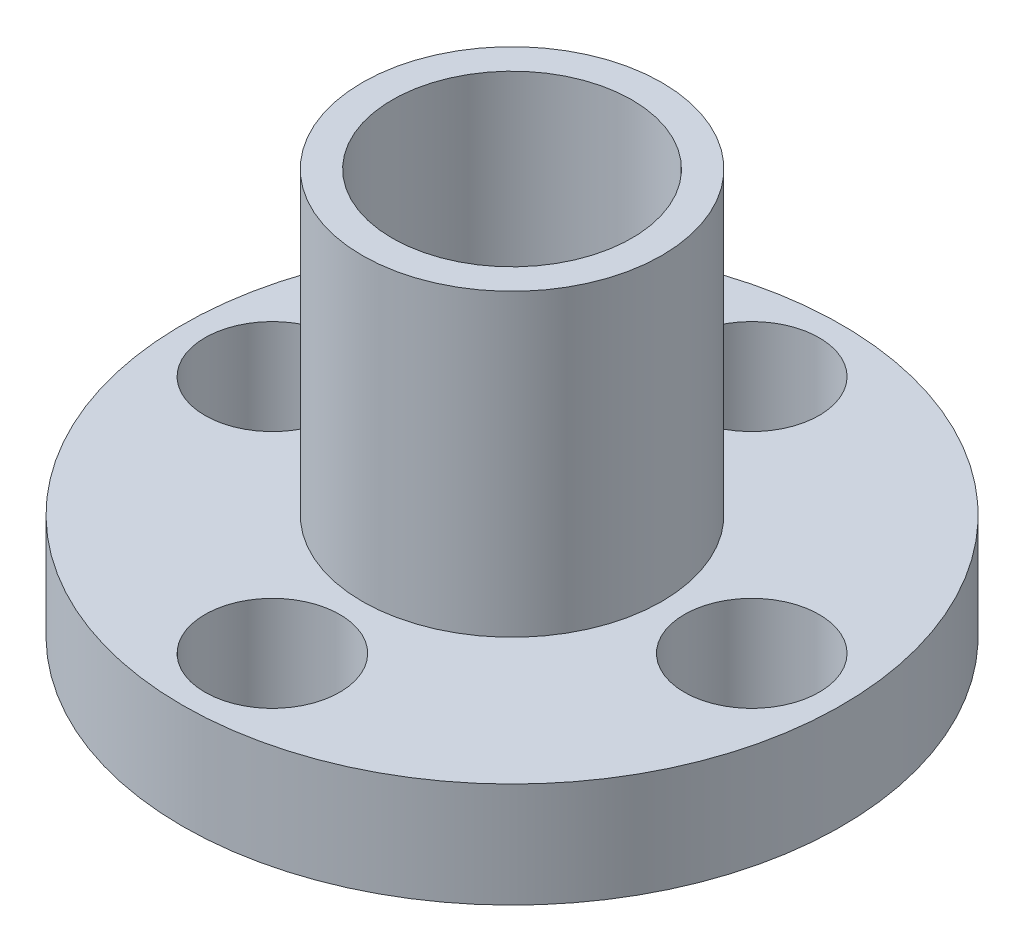
ISO-10303-21;
HEADER;
FILE_DESCRIPTION(('STEP AP214'),'2;1');
FILE_NAME('part.step','',(''),(''),'','','');
FILE_SCHEMA(('AUTOMOTIVE_DESIGN { 1 0 10303 214 1 1 1 1 }'));
ENDSEC;
DATA;
#1=APPLICATION_CONTEXT('core data for automotive mechanical design processes');
#2=APPLICATION_PROTOCOL_DEFINITION('international standard','automotive_design',2000,#1);
#3=PRODUCT_CONTEXT('',#1,'mechanical');
#4=PRODUCT('Part','Part','',(#3));
#5=PRODUCT_RELATED_PRODUCT_CATEGORY('part','',(#4));
#6=PRODUCT_DEFINITION_FORMATION('','',#4);
#7=PRODUCT_DEFINITION_CONTEXT('part definition',#1,'design');
#8=PRODUCT_DEFINITION('design','',#6,#7);
#9=PRODUCT_DEFINITION_SHAPE('','',#8);
#10=(LENGTH_UNIT() NAMED_UNIT(*) SI_UNIT(.MILLI.,.METRE.));
#11=(NAMED_UNIT(*) PLANE_ANGLE_UNIT() SI_UNIT($,.RADIAN.));
#12=(NAMED_UNIT(*) SI_UNIT($,.STERADIAN.) SOLID_ANGLE_UNIT());
#13=UNCERTAINTY_MEASURE_WITH_UNIT(LENGTH_MEASURE(1.E-05),#10,'distance_accuracy_value','');
#14=(GEOMETRIC_REPRESENTATION_CONTEXT(3) GLOBAL_UNCERTAINTY_ASSIGNED_CONTEXT((#13)) GLOBAL_UNIT_ASSIGNED_CONTEXT((#10,
#11,#12)) REPRESENTATION_CONTEXT('',''));
#15=CARTESIAN_POINT('',(0.,0.,0.));
#16=DIRECTION('',(0.,0.,1.));
#17=DIRECTION('',(1.,0.,0.));
#18=AXIS2_PLACEMENT_3D('',#15,#16,#17);
#19=CARTESIAN_POINT('',(0.,0.,0.));
#20=DIRECTION('',(0.,1.,0.));
#21=DIRECTION('',(0.,0.,1.));
#22=AXIS2_PLACEMENT_3D('',#19,#20,#21);
#23=PLANE('',#22);
#24=CARTESIAN_POINT('',(-7.99999999999977,0.,2.27373723977622E-13));
#25=DIRECTION('',(0.,1.,0.));
#26=DIRECTION('',(0.,0.,1.));
#27=AXIS2_PLACEMENT_3D('',#24,#25,#26);
#28=CIRCLE('',#27,2.25000000000036);
#29=CARTESIAN_POINT('',(-7.99999999999977,0.,2.25000000000059));
#30=VERTEX_POINT('',#29);
#31=EDGE_CURVE('E67',#30,#30,#28,.T.);
#32=ORIENTED_EDGE('',*,*,#31,.T.);
#33=EDGE_LOOP('',(#32));
#34=FACE_BOUND('',#33,.T.);
#35=CARTESIAN_POINT('',(8.00000000000023,0.,-2.26394006538304E-13));
#36=DIRECTION('',(0.,1.,0.));
#37=DIRECTION('',(0.,0.,1.));
#38=AXIS2_PLACEMENT_3D('',#35,#36,#37);
#39=CIRCLE('',#38,2.25000000000018);
#40=CARTESIAN_POINT('',(8.00000000000023,0.,2.24999999999995));
#41=VERTEX_POINT('',#40);
#42=EDGE_CURVE('E55',#41,#41,#39,.T.);
#43=ORIENTED_EDGE('',*,*,#42,.T.);
#44=EDGE_LOOP('',(#43));
#45=FACE_BOUND('',#44,.T.);
#46=CARTESIAN_POINT('',(0.,0.,-8.));
#47=DIRECTION('',(0.,1.,0.));
#48=DIRECTION('',(0.,0.,1.));
#49=AXIS2_PLACEMENT_3D('',#46,#47,#48);
#50=CIRCLE('',#49,2.25);
#51=CARTESIAN_POINT('',(0.,0.,-5.75));
#52=VERTEX_POINT('',#51);
#53=EDGE_CURVE('E49',#52,#52,#50,.T.);
#54=ORIENTED_EDGE('',*,*,#53,.T.);
#55=EDGE_LOOP('',(#54));
#56=FACE_BOUND('',#55,.T.);
#57=CARTESIAN_POINT('',(0.,0.,0.));
#58=DIRECTION('',(0.,1.,0.));
#59=DIRECTION('',(0.,0.,1.));
#60=AXIS2_PLACEMENT_3D('',#57,#58,#59);
#61=CIRCLE('',#60,11.);
#62=CARTESIAN_POINT('',(0.,0.,11.));
#63=VERTEX_POINT('',#62);
#64=EDGE_CURVE('E42',#63,#63,#61,.T.);
#65=ORIENTED_EDGE('',*,*,#64,.F.);
#66=EDGE_LOOP('',(#65));
#67=FACE_BOUND('',#66,.T.);
#68=CARTESIAN_POINT('',(4.52788013076608E-13,0.,8.));
#69=DIRECTION('',(0.,1.,0.));
#70=DIRECTION('',(0.,0.,1.));
#71=AXIS2_PLACEMENT_3D('',#68,#69,#70);
#72=CIRCLE('',#71,2.25000000000049);
#73=CARTESIAN_POINT('',(4.52788013076608E-13,0.,10.2500000000005));
#74=VERTEX_POINT('',#73);
#75=EDGE_CURVE('E61',#74,#74,#72,.T.);
#76=ORIENTED_EDGE('',*,*,#75,.T.);
#77=EDGE_LOOP('',(#76));
#78=FACE_BOUND('',#77,.T.);
#79=CARTESIAN_POINT('',(0.,0.,0.));
#80=DIRECTION('',(0.,1.,0.));
#81=DIRECTION('',(0.,0.,1.));
#82=AXIS2_PLACEMENT_3D('',#79,#80,#81);
#83=CIRCLE('',#82,5.);
#84=CARTESIAN_POINT('',(0.,0.,5.));
#85=VERTEX_POINT('',#84);
#86=EDGE_CURVE('E10',#85,#85,#83,.F.);
#87=ORIENTED_EDGE('',*,*,#86,.F.);
#88=EDGE_LOOP('',(#87));
#89=FACE_BOUND('',#88,.T.);
#90=ADVANCED_FACE('F31',(#34,#45,#56,#67,#78,#89),#23,.F.);
#91=CARTESIAN_POINT('',(0.,3.5,0.));
#92=DIRECTION('',(0.,1.,0.));
#93=DIRECTION('',(0.,0.,1.));
#94=AXIS2_PLACEMENT_3D('',#91,#92,#93);
#95=PLANE('',#94);
#96=CARTESIAN_POINT('',(-7.99999999999977,3.5,2.27373723977622E-13));
#97=DIRECTION('',(0.,1.,0.));
#98=DIRECTION('',(0.,0.,1.));
#99=AXIS2_PLACEMENT_3D('',#96,#97,#98);
#100=CIRCLE('',#99,2.25000000000036);
#101=CARTESIAN_POINT('',(-7.99999999999977,3.5,2.25000000000059));
#102=VERTEX_POINT('',#101);
#103=EDGE_CURVE('E64',#102,#102,#100,.T.);
#104=ORIENTED_EDGE('',*,*,#103,.F.);
#105=EDGE_LOOP('',(#104));
#106=FACE_BOUND('',#105,.T.);
#107=CARTESIAN_POINT('',(8.00000000000023,3.5,-2.26394006538304E-13));
#108=DIRECTION('',(0.,1.,0.));
#109=DIRECTION('',(0.,0.,1.));
#110=AXIS2_PLACEMENT_3D('',#107,#108,#109);
#111=CIRCLE('',#110,2.25000000000018);
#112=CARTESIAN_POINT('',(8.00000000000023,3.5,2.24999999999995));
#113=VERTEX_POINT('',#112);
#114=EDGE_CURVE('E52',#113,#113,#111,.T.);
#115=ORIENTED_EDGE('',*,*,#114,.F.);
#116=EDGE_LOOP('',(#115));
#117=FACE_BOUND('',#116,.T.);
#118=CARTESIAN_POINT('',(0.,3.5,-8.));
#119=DIRECTION('',(0.,1.,0.));
#120=DIRECTION('',(0.,0.,1.));
#121=AXIS2_PLACEMENT_3D('',#118,#119,#120);
#122=CIRCLE('',#121,2.25);
#123=CARTESIAN_POINT('',(0.,3.5,-5.75));
#124=VERTEX_POINT('',#123);
#125=EDGE_CURVE('E47',#124,#124,#122,.T.);
#126=ORIENTED_EDGE('',*,*,#125,.F.);
#127=EDGE_LOOP('',(#126));
#128=FACE_BOUND('',#127,.T.);
#129=CARTESIAN_POINT('',(0.,3.5,0.));
#130=DIRECTION('',(0.,1.,0.));
#131=DIRECTION('',(0.,0.,1.));
#132=AXIS2_PLACEMENT_3D('',#129,#130,#131);
#133=CIRCLE('',#132,11.);
#134=CARTESIAN_POINT('',(0.,3.5,11.));
#135=VERTEX_POINT('',#134);
#136=EDGE_CURVE('E38',#135,#135,#133,.T.);
#137=ORIENTED_EDGE('',*,*,#136,.T.);
#138=EDGE_LOOP('',(#137));
#139=FACE_BOUND('',#138,.T.);
#140=CARTESIAN_POINT('',(4.52788013076608E-13,3.5,8.));
#141=DIRECTION('',(0.,1.,0.));
#142=DIRECTION('',(0.,0.,1.));
#143=AXIS2_PLACEMENT_3D('',#140,#141,#142);
#144=CIRCLE('',#143,2.25000000000049);
#145=CARTESIAN_POINT('',(4.52788013076608E-13,3.5,10.2500000000005));
#146=VERTEX_POINT('',#145);
#147=EDGE_CURVE('E58',#146,#146,#144,.T.);
#148=ORIENTED_EDGE('',*,*,#147,.F.);
#149=EDGE_LOOP('',(#148));
#150=FACE_BOUND('',#149,.T.);
#151=CARTESIAN_POINT('',(0.,3.5,0.));
#152=DIRECTION('',(0.,1.,0.));
#153=DIRECTION('',(0.,0.,1.));
#154=AXIS2_PLACEMENT_3D('',#151,#152,#153);
#155=CIRCLE('',#154,5.);
#156=CARTESIAN_POINT('',(0.,3.5,5.));
#157=VERTEX_POINT('',#156);
#158=EDGE_CURVE('E73',#157,#157,#155,.T.);
#159=ORIENTED_EDGE('',*,*,#158,.F.);
#160=EDGE_LOOP('',(#159));
#161=FACE_BOUND('',#160,.T.);
#162=ADVANCED_FACE('F106',(#106,#117,#128,#139,#150,#161),#95,.T.);
#163=CARTESIAN_POINT('',(0.,3.5,0.));
#164=DIRECTION('',(0.,-1.,0.));
#165=DIRECTION('',(0.,0.,-1.));
#166=AXIS2_PLACEMENT_3D('',#163,#164,#165);
#167=CYLINDRICAL_SURFACE('',#166,11.);
#168=ORIENTED_EDGE('',*,*,#136,.F.);
#169=EDGE_LOOP('',(#168));
#170=FACE_BOUND('',#169,.T.);
#171=ORIENTED_EDGE('',*,*,#64,.T.);
#172=EDGE_LOOP('',(#171));
#173=FACE_BOUND('',#172,.T.);
#174=ADVANCED_FACE('F33',(#170,#173),#167,.T.);
#175=CARTESIAN_POINT('',(0.,3.5,-8.));
#176=DIRECTION('',(0.,-1.,0.));
#177=DIRECTION('',(0.,0.,-1.));
#178=AXIS2_PLACEMENT_3D('',#175,#176,#177);
#179=CYLINDRICAL_SURFACE('',#178,2.25);
#180=ORIENTED_EDGE('',*,*,#125,.T.);
#181=EDGE_LOOP('',(#180));
#182=FACE_BOUND('',#181,.T.);
#183=ORIENTED_EDGE('',*,*,#53,.F.);
#184=EDGE_LOOP('',(#183));
#185=FACE_BOUND('',#184,.T.);
#186=ADVANCED_FACE('F115',(#182,#185),#179,.F.);
#187=CARTESIAN_POINT('',(0.,3.5,0.));
#188=DIRECTION('',(0.,-1.,0.));
#189=DIRECTION('',(0.,0.,-1.));
#190=AXIS2_PLACEMENT_3D('',#187,#188,#189);
#191=CYLINDRICAL_SURFACE('',#190,4.);
#192=CARTESIAN_POINT('',(0.,13.5,0.));
#193=DIRECTION('',(0.,1.,0.));
#194=DIRECTION('',(0.,0.,1.));
#195=AXIS2_PLACEMENT_3D('',#192,#193,#194);
#196=CIRCLE('',#195,4.);
#197=CARTESIAN_POINT('',(0.,13.5,4.));
#198=VERTEX_POINT('',#197);
#199=EDGE_CURVE('E76',#198,#198,#196,.T.);
#200=ORIENTED_EDGE('',*,*,#199,.T.);
#201=EDGE_LOOP('',(#200));
#202=FACE_BOUND('',#201,.T.);
#203=CARTESIAN_POINT('',(0.,-1.5,0.));
#204=DIRECTION('',(0.,-1.,0.));
#205=DIRECTION('',(0.,0.,-1.));
#206=AXIS2_PLACEMENT_3D('',#203,#204,#205);
#207=CIRCLE('',#206,4.);
#208=CARTESIAN_POINT('',(0.,-1.5,-4.));
#209=VERTEX_POINT('',#208);
#210=EDGE_CURVE('E84',#209,#209,#207,.T.);
#211=ORIENTED_EDGE('',*,*,#210,.T.);
#212=EDGE_LOOP('',(#211));
#213=FACE_BOUND('',#212,.T.);
#214=ADVANCED_FACE('F88',(#202,#213),#191,.F.);
#215=CARTESIAN_POINT('',(8.00000000000023,3.5,-2.26394006538304E-13));
#216=DIRECTION('',(0.,-1.,0.));
#217=DIRECTION('',(0.,0.,-1.));
#218=AXIS2_PLACEMENT_3D('',#215,#216,#217);
#219=CYLINDRICAL_SURFACE('',#218,2.25000000000018);
#220=ORIENTED_EDGE('',*,*,#114,.T.);
#221=EDGE_LOOP('',(#220));
#222=FACE_BOUND('',#221,.T.);
#223=ORIENTED_EDGE('',*,*,#42,.F.);
#224=EDGE_LOOP('',(#223));
#225=FACE_BOUND('',#224,.T.);
#226=ADVANCED_FACE('F121',(#222,#225),#219,.F.);
#227=CARTESIAN_POINT('',(4.52788013076608E-13,3.5,8.));
#228=DIRECTION('',(0.,-1.,0.));
#229=DIRECTION('',(0.,0.,-1.));
#230=AXIS2_PLACEMENT_3D('',#227,#228,#229);
#231=CYLINDRICAL_SURFACE('',#230,2.25000000000049);
#232=ORIENTED_EDGE('',*,*,#147,.T.);
#233=EDGE_LOOP('',(#232));
#234=FACE_BOUND('',#233,.T.);
#235=ORIENTED_EDGE('',*,*,#75,.F.);
#236=EDGE_LOOP('',(#235));
#237=FACE_BOUND('',#236,.T.);
#238=ADVANCED_FACE('F125',(#234,#237),#231,.F.);
#239=CARTESIAN_POINT('',(-7.99999999999977,3.5,2.27373723977622E-13));
#240=DIRECTION('',(0.,-1.,0.));
#241=DIRECTION('',(0.,0.,-1.));
#242=AXIS2_PLACEMENT_3D('',#239,#240,#241);
#243=CYLINDRICAL_SURFACE('',#242,2.25000000000036);
#244=ORIENTED_EDGE('',*,*,#103,.T.);
#245=EDGE_LOOP('',(#244));
#246=FACE_BOUND('',#245,.T.);
#247=ORIENTED_EDGE('',*,*,#31,.F.);
#248=EDGE_LOOP('',(#247));
#249=FACE_BOUND('',#248,.T.);
#250=ADVANCED_FACE('F129',(#246,#249),#243,.F.);
#251=CARTESIAN_POINT('',(0.,13.5,0.));
#252=DIRECTION('',(0.,1.,0.));
#253=DIRECTION('',(0.,0.,1.));
#254=AXIS2_PLACEMENT_3D('',#251,#252,#253);
#255=PLANE('',#254);
#256=CARTESIAN_POINT('',(0.,13.5,0.));
#257=DIRECTION('',(0.,1.,0.));
#258=DIRECTION('',(0.,0.,1.));
#259=AXIS2_PLACEMENT_3D('',#256,#257,#258);
#260=CIRCLE('',#259,5.);
#261=CARTESIAN_POINT('',(0.,13.5,5.));
#262=VERTEX_POINT('',#261);
#263=EDGE_CURVE('E70',#262,#262,#260,.T.);
#264=ORIENTED_EDGE('',*,*,#263,.T.);
#265=EDGE_LOOP('',(#264));
#266=FACE_BOUND('',#265,.T.);
#267=ORIENTED_EDGE('',*,*,#199,.F.);
#268=EDGE_LOOP('',(#267));
#269=FACE_BOUND('',#268,.T.);
#270=ADVANCED_FACE('F102',(#266,#269),#255,.T.);
#271=CARTESIAN_POINT('',(0.,13.5,0.));
#272=DIRECTION('',(0.,-1.,0.));
#273=DIRECTION('',(0.,0.,-1.));
#274=AXIS2_PLACEMENT_3D('',#271,#272,#273);
#275=CYLINDRICAL_SURFACE('',#274,5.);
#276=ORIENTED_EDGE('',*,*,#263,.F.);
#277=EDGE_LOOP('',(#276));
#278=FACE_BOUND('',#277,.T.);
#279=ORIENTED_EDGE('',*,*,#158,.T.);
#280=EDGE_LOOP('',(#279));
#281=FACE_BOUND('',#280,.T.);
#282=ADVANCED_FACE('F93',(#278,#281),#275,.T.);
#283=CARTESIAN_POINT('',(0.,-1.5,0.));
#284=DIRECTION('',(0.,-1.,0.));
#285=DIRECTION('',(0.,0.,-1.));
#286=AXIS2_PLACEMENT_3D('',#283,#284,#285);
#287=PLANE('',#286);
#288=CARTESIAN_POINT('',(0.,-1.5,0.));
#289=DIRECTION('',(0.,-1.,0.));
#290=DIRECTION('',(0.,0.,-1.));
#291=AXIS2_PLACEMENT_3D('',#288,#289,#290);
#292=CIRCLE('',#291,5.);
#293=CARTESIAN_POINT('',(0.,-1.5,-5.));
#294=VERTEX_POINT('',#293);
#295=EDGE_CURVE('E81',#294,#294,#292,.T.);
#296=ORIENTED_EDGE('',*,*,#295,.T.);
#297=EDGE_LOOP('',(#296));
#298=FACE_BOUND('',#297,.T.);
#299=ORIENTED_EDGE('',*,*,#210,.F.);
#300=EDGE_LOOP('',(#299));
#301=FACE_BOUND('',#300,.T.);
#302=ADVANCED_FACE('F90',(#298,#301),#287,.T.);
#303=CARTESIAN_POINT('',(0.,-1.5,0.));
#304=DIRECTION('',(0.,1.,0.));
#305=DIRECTION('',(0.,0.,1.));
#306=AXIS2_PLACEMENT_3D('',#303,#304,#305);
#307=CYLINDRICAL_SURFACE('',#306,5.);
#308=ORIENTED_EDGE('',*,*,#295,.F.);
#309=EDGE_LOOP('',(#308));
#310=FACE_BOUND('',#309,.T.);
#311=ORIENTED_EDGE('',*,*,#86,.T.);
#312=EDGE_LOOP('',(#311));
#313=FACE_BOUND('',#312,.T.);
#314=ADVANCED_FACE('F92',(#310,#313),#307,.T.);
#315=CLOSED_SHELL('',(#90,#162,#174,#186,#214,#226,#238,#250,#270,#282,#302,#314));
#316=MANIFOLD_SOLID_BREP('B2',#315);
#317=ADVANCED_BREP_SHAPE_REPRESENTATION('',(#18,#316),#14);
#318=SHAPE_DEFINITION_REPRESENTATION(#9,#317);
ENDSEC;
END-ISO-10303-21;
